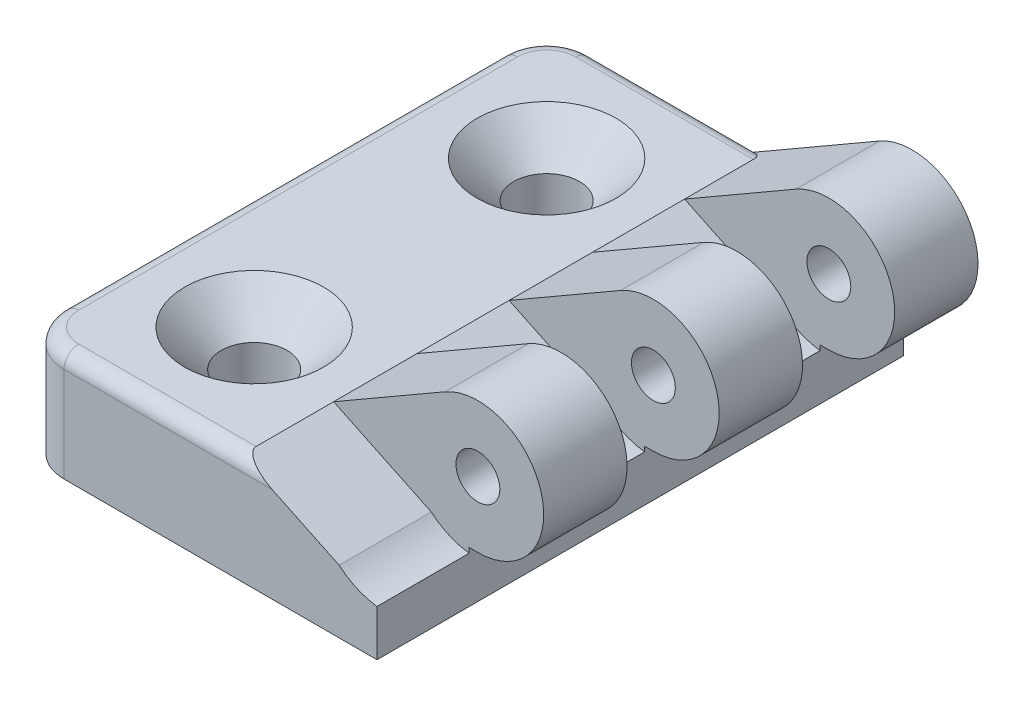
ISO-10303-21;
HEADER;
FILE_DESCRIPTION(('STEP AP214'),'2;1');
FILE_NAME('part.step','',(''),(''),'','','');
FILE_SCHEMA(('AUTOMOTIVE_DESIGN { 1 0 10303 214 1 1 1 1 }'));
ENDSEC;
DATA;
#1=APPLICATION_CONTEXT('core data for automotive mechanical design processes');
#2=APPLICATION_PROTOCOL_DEFINITION('international standard','automotive_design',2000,#1);
#3=PRODUCT_CONTEXT('',#1,'mechanical');
#4=PRODUCT('Part','Part','',(#3));
#5=PRODUCT_RELATED_PRODUCT_CATEGORY('part','',(#4));
#6=PRODUCT_DEFINITION_FORMATION('','',#4);
#7=PRODUCT_DEFINITION_CONTEXT('part definition',#1,'design');
#8=PRODUCT_DEFINITION('design','',#6,#7);
#9=PRODUCT_DEFINITION_SHAPE('','',#8);
#10=(LENGTH_UNIT() NAMED_UNIT(*) SI_UNIT(.MILLI.,.METRE.));
#11=(NAMED_UNIT(*) PLANE_ANGLE_UNIT() SI_UNIT($,.RADIAN.));
#12=(NAMED_UNIT(*) SI_UNIT($,.STERADIAN.) SOLID_ANGLE_UNIT());
#13=UNCERTAINTY_MEASURE_WITH_UNIT(LENGTH_MEASURE(1.E-05),#10,'distance_accuracy_value','');
#14=(GEOMETRIC_REPRESENTATION_CONTEXT(3) GLOBAL_UNCERTAINTY_ASSIGNED_CONTEXT((#13)) GLOBAL_UNIT_ASSIGNED_CONTEXT((#10,
#11,#12)) REPRESENTATION_CONTEXT('',''));
#15=CARTESIAN_POINT('',(0.,0.,0.));
#16=DIRECTION('',(0.,0.,1.));
#17=DIRECTION('',(1.,0.,0.));
#18=AXIS2_PLACEMENT_3D('',#15,#16,#17);
#19=CARTESIAN_POINT('',(12.75,7.89711431702908,-36.));
#20=DIRECTION('',(-0.499999999999995,0.866025403784442,0.));
#21=DIRECTION('',(-0.866025403784442,-0.499999999999995,0.));
#22=AXIS2_PLACEMENT_3D('',#19,#20,#21);
#23=PLANE('',#22);
#24=DIRECTION('',(-0.866025403784442,-0.499999999999995,0.));
#25=VECTOR('',#24,1.);
#26=CARTESIAN_POINT('',(12.75,7.89711431702908,-36.));
#27=LINE('',#26,#25);
#28=CARTESIAN_POINT('',(12.75,7.89711431702908,-36.));
#29=VERTEX_POINT('',#28);
#30=CARTESIAN_POINT('',(3.40192378864723,2.49999999999948,-36.));
#31=VERTEX_POINT('',#30);
#32=EDGE_CURVE('E286',#29,#31,#27,.T.);
#33=ORIENTED_EDGE('',*,*,#32,.T.);
#34=CARTESIAN_POINT('',(3.40192378864724,2.49999999999948,-35.));
#35=DIRECTION('',(-0.499999999999995,0.866025403784442,0.));
#36=DIRECTION('',(0.866025403784442,0.499999999999995,0.));
#37=AXIS2_PLACEMENT_3D('',#34,#35,#36);
#38=ELLIPSE('',#37,2.00000000000002,1.);
#39=CARTESIAN_POINT('',(5.13397459621614,3.49999999999948,-35.));
#40=VERTEX_POINT('',#39);
#41=EDGE_CURVE('E11',#31,#40,#38,.F.);
#42=ORIENTED_EDGE('',*,*,#41,.T.);
#43=DIRECTION('',(0.,0.,1.));
#44=VECTOR('',#43,1.);
#45=CARTESIAN_POINT('',(5.13397459621614,3.49999999999948,-36.));
#46=LINE('',#45,#44);
#47=CARTESIAN_POINT('',(5.13397459621614,3.49999999999948,-30.3));
#48=VERTEX_POINT('',#47);
#49=EDGE_CURVE('E236',#40,#48,#46,.T.);
#50=ORIENTED_EDGE('',*,*,#49,.T.);
#51=DIRECTION('',(-0.866025403784442,-0.499999999999995,0.));
#52=VECTOR('',#51,1.);
#53=CARTESIAN_POINT('',(12.75,7.89711431702908,-30.3));
#54=LINE('',#53,#52);
#55=CARTESIAN_POINT('',(12.75,7.89711431702908,-30.3));
#56=VERTEX_POINT('',#55);
#57=EDGE_CURVE('E223',#56,#48,#54,.T.);
#58=ORIENTED_EDGE('',*,*,#57,.F.);
#59=DIRECTION('',(0.,0.,1.));
#60=VECTOR('',#59,1.);
#61=CARTESIAN_POINT('',(12.75,7.89711431702908,-36.));
#62=LINE('',#61,#60);
#63=EDGE_CURVE('E233',#29,#56,#62,.T.);
#64=ORIENTED_EDGE('',*,*,#63,.F.);
#65=EDGE_LOOP('',(#33,#42,#50,#58,#64));
#66=FACE_BOUND('',#65,.T.);
#67=ADVANCED_FACE('F38',(#66),#23,.T.);
#68=CARTESIAN_POINT('',(15.,3.99999999999909,-36.));
#69=DIRECTION('',(0.,0.,1.));
#70=DIRECTION('',(1.,0.,0.));
#71=AXIS2_PLACEMENT_3D('',#68,#69,#70);
#72=CYLINDRICAL_SURFACE('',#71,4.5);
#73=ORIENTED_EDGE('',*,*,#63,.T.);
#74=CARTESIAN_POINT('',(15.,3.99999999999909,-30.3));
#75=DIRECTION('',(0.,0.,1.));
#76=DIRECTION('',(1.,0.,0.));
#77=AXIS2_PLACEMENT_3D('',#74,#75,#76);
#78=CIRCLE('',#77,4.5);
#79=CARTESIAN_POINT('',(14.9999999999995,-0.500000000000907,-30.3));
#80=VERTEX_POINT('',#79);
#81=EDGE_CURVE('E218',#80,#56,#78,.T.);
#82=ORIENTED_EDGE('',*,*,#81,.F.);
#83=DIRECTION('',(0.,0.,1.));
#84=VECTOR('',#83,1.);
#85=CARTESIAN_POINT('',(14.9999999999995,-0.500000000000907,-36.));
#86=LINE('',#85,#84);
#87=CARTESIAN_POINT('',(14.9999999999995,-0.500000000000907,-36.));
#88=VERTEX_POINT('',#87);
#89=EDGE_CURVE('E250',#88,#80,#86,.T.);
#90=ORIENTED_EDGE('',*,*,#89,.F.);
#91=CARTESIAN_POINT('',(15.,3.99999999999909,-36.));
#92=DIRECTION('',(0.,0.,1.));
#93=DIRECTION('',(1.,0.,0.));
#94=AXIS2_PLACEMENT_3D('',#91,#92,#93);
#95=CIRCLE('',#94,4.5);
#96=EDGE_CURVE('E242',#88,#29,#95,.T.);
#97=ORIENTED_EDGE('',*,*,#96,.T.);
#98=EDGE_LOOP('',(#73,#82,#90,#97));
#99=FACE_BOUND('',#98,.T.);
#100=ADVANCED_FACE('F240',(#99),#72,.T.);
#101=CARTESIAN_POINT('',(14.9999999999995,-0.500000000000907,-36.));
#102=DIRECTION('',(0.,-1.,0.));
#103=DIRECTION('',(1.,0.,0.));
#104=AXIS2_PLACEMENT_3D('',#101,#102,#103);
#105=PLANE('',#104);
#106=ORIENTED_EDGE('',*,*,#89,.T.);
#107=DIRECTION('',(-1.,0.,0.));
#108=VECTOR('',#107,1.);
#109=CARTESIAN_POINT('',(14.9999999999995,-0.500000000000907,-30.3));
#110=LINE('',#109,#108);
#111=CARTESIAN_POINT('',(14.3999999999995,-0.500000000000907,-30.3));
#112=VERTEX_POINT('',#111);
#113=EDGE_CURVE('E226',#80,#112,#110,.T.);
#114=ORIENTED_EDGE('',*,*,#113,.T.);
#115=DIRECTION('',(0.,0.,1.));
#116=VECTOR('',#115,1.);
#117=CARTESIAN_POINT('',(14.3999999999995,-0.500000000000907,-36.));
#118=LINE('',#117,#116);
#119=CARTESIAN_POINT('',(14.3999999999995,-0.500000000000907,-36.));
#120=VERTEX_POINT('',#119);
#121=EDGE_CURVE('E261',#120,#112,#118,.T.);
#122=ORIENTED_EDGE('',*,*,#121,.F.);
#123=DIRECTION('',(1.,0.,0.));
#124=VECTOR('',#123,1.);
#125=CARTESIAN_POINT('',(14.9999999999995,-0.500000000000907,-36.));
#126=LINE('',#125,#124);
#127=EDGE_CURVE('E478',#120,#88,#126,.T.);
#128=ORIENTED_EDGE('',*,*,#127,.T.);
#129=EDGE_LOOP('',(#106,#114,#122,#128));
#130=FACE_BOUND('',#129,.T.);
#131=ADVANCED_FACE('F523',(#130),#105,.T.);
#132=CARTESIAN_POINT('',(15.,3.99999999999909,-36.));
#133=DIRECTION('',(0.,0.,1.));
#134=DIRECTION('',(1.,0.,0.));
#135=AXIS2_PLACEMENT_3D('',#132,#133,#134);
#136=CYLINDRICAL_SURFACE('',#135,1.5);
#137=CARTESIAN_POINT('',(15.,3.99999999999909,-36.));
#138=DIRECTION('',(0.,0.,1.));
#139=DIRECTION('',(1.,0.,0.));
#140=AXIS2_PLACEMENT_3D('',#137,#138,#139);
#141=CIRCLE('',#140,1.5);
#142=CARTESIAN_POINT('',(16.5,3.99999999999909,-36.));
#143=VERTEX_POINT('',#142);
#144=EDGE_CURVE('E469',#143,#143,#141,.T.);
#145=ORIENTED_EDGE('',*,*,#144,.F.);
#146=EDGE_LOOP('',(#145));
#147=FACE_BOUND('',#146,.T.);
#148=CARTESIAN_POINT('',(15.,3.99999999999909,-30.3));
#149=DIRECTION('',(0.,0.,1.));
#150=DIRECTION('',(1.,0.,0.));
#151=AXIS2_PLACEMENT_3D('',#148,#149,#150);
#152=CIRCLE('',#151,1.5);
#153=CARTESIAN_POINT('',(16.5,3.99999999999909,-30.3));
#154=VERTEX_POINT('',#153);
#155=EDGE_CURVE('E400',#154,#154,#152,.F.);
#156=ORIENTED_EDGE('',*,*,#155,.F.);
#157=EDGE_LOOP('',(#156));
#158=FACE_BOUND('',#157,.T.);
#159=ADVANCED_FACE('F532',(#147,#158),#136,.F.);
#160=CARTESIAN_POINT('',(14.3999999999995,-0.500000000000907,-36.));
#161=DIRECTION('',(1.,0.,0.));
#162=DIRECTION('',(0.,1.,0.));
#163=AXIS2_PLACEMENT_3D('',#160,#161,#162);
#164=PLANE('',#163);
#165=ORIENTED_EDGE('',*,*,#121,.T.);
#166=DIRECTION('',(0.,-1.,0.));
#167=VECTOR('',#166,1.);
#168=CARTESIAN_POINT('',(14.3999999999995,-0.500000000000907,-30.3));
#169=LINE('',#168,#167);
#170=CARTESIAN_POINT('',(14.3999999999996,-0.842600763875235,-30.3));
#171=VERTEX_POINT('',#170);
#172=EDGE_CURVE('E301',#112,#171,#169,.T.);
#173=ORIENTED_EDGE('',*,*,#172,.T.);
#174=DIRECTION('',(0.,0.,1.));
#175=VECTOR('',#174,1.);
#176=CARTESIAN_POINT('',(14.3999999999996,-0.842600763875235,-30.3));
#177=LINE('',#176,#175);
#178=CARTESIAN_POINT('',(14.3999999999996,-0.842600763875235,-24.));
#179=VERTEX_POINT('',#178);
#180=EDGE_CURVE('E388',#171,#179,#177,.T.);
#181=ORIENTED_EDGE('',*,*,#180,.T.);
#182=DIRECTION('',(0.,-1.,0.));
#183=VECTOR('',#182,1.);
#184=CARTESIAN_POINT('',(14.3999999999995,-0.500000000000907,-24.));
#185=LINE('',#184,#183);
#186=CARTESIAN_POINT('',(14.3999999999995,-0.500000000000907,-24.));
#187=VERTEX_POINT('',#186);
#188=EDGE_CURVE('E299',#187,#179,#185,.T.);
#189=ORIENTED_EDGE('',*,*,#188,.F.);
#190=CARTESIAN_POINT('',(14.3999999999995,-0.500000000000907,-18.3));
#191=VERTEX_POINT('',#190);
#192=EDGE_CURVE('E268',#187,#191,#118,.T.);
#193=ORIENTED_EDGE('',*,*,#192,.T.);
#194=DIRECTION('',(0.,-1.,0.));
#195=VECTOR('',#194,1.);
#196=CARTESIAN_POINT('',(14.3999999999995,-0.500000000000907,-18.3));
#197=LINE('',#196,#195);
#198=CARTESIAN_POINT('',(14.3999999999996,-0.842600763875235,-18.3));
#199=VERTEX_POINT('',#198);
#200=EDGE_CURVE('E296',#191,#199,#197,.T.);
#201=ORIENTED_EDGE('',*,*,#200,.T.);
#202=DIRECTION('',(0.,0.,1.));
#203=VECTOR('',#202,1.);
#204=CARTESIAN_POINT('',(14.3999999999996,-0.842600763875235,-18.3));
#205=LINE('',#204,#203);
#206=CARTESIAN_POINT('',(14.3999999999996,-0.842600763875235,-12.));
#207=VERTEX_POINT('',#206);
#208=EDGE_CURVE('E427',#199,#207,#205,.T.);
#209=ORIENTED_EDGE('',*,*,#208,.T.);
#210=DIRECTION('',(0.,-1.,0.));
#211=VECTOR('',#210,1.);
#212=CARTESIAN_POINT('',(14.3999999999995,-0.500000000000907,-12.));
#213=LINE('',#212,#211);
#214=CARTESIAN_POINT('',(14.3999999999995,-0.500000000000907,-12.));
#215=VERTEX_POINT('',#214);
#216=EDGE_CURVE('E294',#215,#207,#213,.T.);
#217=ORIENTED_EDGE('',*,*,#216,.F.);
#218=CARTESIAN_POINT('',(14.3999999999995,-0.500000000000907,-6.3));
#219=VERTEX_POINT('',#218);
#220=EDGE_CURVE('E269',#215,#219,#118,.T.);
#221=ORIENTED_EDGE('',*,*,#220,.T.);
#222=DIRECTION('',(0.,-1.,0.));
#223=VECTOR('',#222,1.);
#224=CARTESIAN_POINT('',(14.3999999999995,-0.500000000000907,-6.3));
#225=LINE('',#224,#223);
#226=CARTESIAN_POINT('',(14.3999999999996,-0.842600763875235,-6.3));
#227=VERTEX_POINT('',#226);
#228=EDGE_CURVE('E292',#219,#227,#225,.T.);
#229=ORIENTED_EDGE('',*,*,#228,.T.);
#230=DIRECTION('',(0.,0.,1.));
#231=VECTOR('',#230,1.);
#232=CARTESIAN_POINT('',(14.3999999999996,-0.842600763875235,-6.3));
#233=LINE('',#232,#231);
#234=CARTESIAN_POINT('',(14.3999999999996,-0.842600763875235,0.));
#235=VERTEX_POINT('',#234);
#236=EDGE_CURVE('E293',#227,#235,#233,.T.);
#237=ORIENTED_EDGE('',*,*,#236,.T.);
#238=DIRECTION('',(0.,1.,0.));
#239=VECTOR('',#238,1.);
#240=CARTESIAN_POINT('',(14.3999999999995,-0.500000000000907,0.));
#241=LINE('',#240,#239);
#242=CARTESIAN_POINT('',(14.3999999999996,-4.00000000000052,0.));
#243=VERTEX_POINT('',#242);
#244=EDGE_CURVE('E476',#243,#235,#241,.T.);
#245=ORIENTED_EDGE('',*,*,#244,.F.);
#246=DIRECTION('',(0.,0.,1.));
#247=VECTOR('',#246,1.);
#248=CARTESIAN_POINT('',(14.3999999999996,-4.00000000000052,-36.));
#249=LINE('',#248,#247);
#250=CARTESIAN_POINT('',(14.3999999999996,-4.00000000000052,-36.));
#251=VERTEX_POINT('',#250);
#252=EDGE_CURVE('E274',#251,#243,#249,.T.);
#253=ORIENTED_EDGE('',*,*,#252,.F.);
#254=DIRECTION('',(0.,1.,0.));
#255=VECTOR('',#254,1.);
#256=CARTESIAN_POINT('',(14.3999999999995,-0.500000000000907,-36.));
#257=LINE('',#256,#255);
#258=EDGE_CURVE('E475',#251,#120,#257,.T.);
#259=ORIENTED_EDGE('',*,*,#258,.T.);
#260=EDGE_LOOP('',(#165,#173,#181,#189,#193,#201,#209,#217,#221,#229,#237,#245,#253,#259));
#261=FACE_BOUND('',#260,.T.);
#262=ADVANCED_FACE('F547',(#261),#164,.T.);
#263=DIRECTION('',(-0.866025403784442,-0.499999999999995,0.));
#264=VECTOR('',#263,1.);
#265=CARTESIAN_POINT('',(12.75,7.89711431702908,-24.));
#266=LINE('',#265,#264);
#267=CARTESIAN_POINT('',(12.75,7.89711431702908,-24.));
#268=VERTEX_POINT('',#267);
#269=CARTESIAN_POINT('',(5.13397459621614,3.49999999999948,-24.));
#270=VERTEX_POINT('',#269);
#271=EDGE_CURVE('E380',#268,#270,#266,.T.);
#272=ORIENTED_EDGE('',*,*,#271,.T.);
#273=CARTESIAN_POINT('',(5.13397459621614,3.49999999999948,-18.3));
#274=VERTEX_POINT('',#273);
#275=EDGE_CURVE('E247',#270,#274,#46,.T.);
#276=ORIENTED_EDGE('',*,*,#275,.T.);
#277=DIRECTION('',(-0.866025403784442,-0.499999999999995,0.));
#278=VECTOR('',#277,1.);
#279=CARTESIAN_POINT('',(12.75,7.89711431702908,-18.3));
#280=LINE('',#279,#278);
#281=CARTESIAN_POINT('',(12.75,7.89711431702908,-18.3));
#282=VERTEX_POINT('',#281);
#283=EDGE_CURVE('E407',#282,#274,#280,.T.);
#284=ORIENTED_EDGE('',*,*,#283,.F.);
#285=EDGE_CURVE('E244',#268,#282,#62,.T.);
#286=ORIENTED_EDGE('',*,*,#285,.F.);
#287=EDGE_LOOP('',(#272,#276,#284,#286));
#288=FACE_BOUND('',#287,.T.);
#289=ADVANCED_FACE('F488',(#288),#23,.T.);
#290=CARTESIAN_POINT('',(15.,3.99999999999909,-24.));
#291=DIRECTION('',(0.,0.,1.));
#292=DIRECTION('',(1.,0.,0.));
#293=AXIS2_PLACEMENT_3D('',#290,#291,#292);
#294=CIRCLE('',#293,4.5);
#295=CARTESIAN_POINT('',(14.9999999999995,-0.500000000000907,-24.));
#296=VERTEX_POINT('',#295);
#297=EDGE_CURVE('E370',#296,#268,#294,.T.);
#298=ORIENTED_EDGE('',*,*,#297,.T.);
#299=ORIENTED_EDGE('',*,*,#285,.T.);
#300=CARTESIAN_POINT('',(15.,3.99999999999909,-18.3));
#301=DIRECTION('',(0.,0.,1.));
#302=DIRECTION('',(1.,0.,0.));
#303=AXIS2_PLACEMENT_3D('',#300,#301,#302);
#304=CIRCLE('',#303,4.5);
#305=CARTESIAN_POINT('',(14.9999999999995,-0.500000000000907,-18.3));
#306=VERTEX_POINT('',#305);
#307=EDGE_CURVE('E404',#306,#282,#304,.T.);
#308=ORIENTED_EDGE('',*,*,#307,.F.);
#309=EDGE_CURVE('E256',#296,#306,#86,.T.);
#310=ORIENTED_EDGE('',*,*,#309,.F.);
#311=EDGE_LOOP('',(#298,#299,#308,#310));
#312=FACE_BOUND('',#311,.T.);
#313=ADVANCED_FACE('F535',(#312),#72,.T.);
#314=DIRECTION('',(-1.,0.,0.));
#315=VECTOR('',#314,1.);
#316=CARTESIAN_POINT('',(14.9999999999995,-0.500000000000907,-24.));
#317=LINE('',#316,#315);
#318=EDGE_CURVE('E391',#296,#187,#317,.T.);
#319=ORIENTED_EDGE('',*,*,#318,.F.);
#320=ORIENTED_EDGE('',*,*,#309,.T.);
#321=DIRECTION('',(-1.,0.,0.));
#322=VECTOR('',#321,1.);
#323=CARTESIAN_POINT('',(14.9999999999995,-0.500000000000907,-18.3));
#324=LINE('',#323,#322);
#325=EDGE_CURVE('E438',#306,#191,#324,.T.);
#326=ORIENTED_EDGE('',*,*,#325,.T.);
#327=ORIENTED_EDGE('',*,*,#192,.F.);
#328=EDGE_LOOP('',(#319,#320,#326,#327));
#329=FACE_BOUND('',#328,.T.);
#330=ADVANCED_FACE('F524',(#329),#105,.T.);
#331=CARTESIAN_POINT('',(15.,3.99999999999909,-24.));
#332=DIRECTION('',(0.,0.,1.));
#333=DIRECTION('',(1.,0.,0.));
#334=AXIS2_PLACEMENT_3D('',#331,#332,#333);
#335=CIRCLE('',#334,1.5);
#336=CARTESIAN_POINT('',(16.5,3.99999999999909,-24.));
#337=VERTEX_POINT('',#336);
#338=EDGE_CURVE('E396',#337,#337,#335,.F.);
#339=ORIENTED_EDGE('',*,*,#338,.T.);
#340=EDGE_LOOP('',(#339));
#341=FACE_BOUND('',#340,.T.);
#342=CARTESIAN_POINT('',(15.,3.99999999999909,-18.3));
#343=DIRECTION('',(0.,0.,1.));
#344=DIRECTION('',(1.,0.,0.));
#345=AXIS2_PLACEMENT_3D('',#342,#343,#344);
#346=CIRCLE('',#345,1.5);
#347=CARTESIAN_POINT('',(16.5,3.99999999999909,-18.3));
#348=VERTEX_POINT('',#347);
#349=EDGE_CURVE('E441',#348,#348,#346,.F.);
#350=ORIENTED_EDGE('',*,*,#349,.F.);
#351=EDGE_LOOP('',(#350));
#352=FACE_BOUND('',#351,.T.);
#353=ADVANCED_FACE('F533',(#341,#352),#136,.F.);
#354=DIRECTION('',(-0.866025403784442,-0.499999999999995,0.));
#355=VECTOR('',#354,1.);
#356=CARTESIAN_POINT('',(12.75,7.89711431702908,-12.));
#357=LINE('',#356,#355);
#358=CARTESIAN_POINT('',(12.75,7.89711431702908,-12.));
#359=VERTEX_POINT('',#358);
#360=CARTESIAN_POINT('',(5.13397459621614,3.49999999999948,-12.));
#361=VERTEX_POINT('',#360);
#362=EDGE_CURVE('E419',#359,#361,#357,.T.);
#363=ORIENTED_EDGE('',*,*,#362,.T.);
#364=CARTESIAN_POINT('',(5.13397459621614,3.49999999999948,-6.3));
#365=VERTEX_POINT('',#364);
#366=EDGE_CURVE('E243',#361,#365,#46,.T.);
#367=ORIENTED_EDGE('',*,*,#366,.T.);
#368=DIRECTION('',(-0.866025403784442,-0.499999999999995,0.));
#369=VECTOR('',#368,1.);
#370=CARTESIAN_POINT('',(12.75,7.89711431702908,-6.3));
#371=LINE('',#370,#369);
#372=CARTESIAN_POINT('',(12.75,7.89711431702908,-6.3));
#373=VERTEX_POINT('',#372);
#374=EDGE_CURVE('E447',#373,#365,#371,.T.);
#375=ORIENTED_EDGE('',*,*,#374,.F.);
#376=EDGE_CURVE('E246',#359,#373,#62,.T.);
#377=ORIENTED_EDGE('',*,*,#376,.F.);
#378=EDGE_LOOP('',(#363,#367,#375,#377));
#379=FACE_BOUND('',#378,.T.);
#380=ADVANCED_FACE('F509',(#379),#23,.T.);
#381=CARTESIAN_POINT('',(15.,3.99999999999909,-12.));
#382=DIRECTION('',(0.,0.,1.));
#383=DIRECTION('',(1.,0.,0.));
#384=AXIS2_PLACEMENT_3D('',#381,#382,#383);
#385=CIRCLE('',#384,4.5);
#386=CARTESIAN_POINT('',(14.9999999999995,-0.500000000000907,-12.));
#387=VERTEX_POINT('',#386);
#388=EDGE_CURVE('E403',#387,#359,#385,.T.);
#389=ORIENTED_EDGE('',*,*,#388,.T.);
#390=ORIENTED_EDGE('',*,*,#376,.T.);
#391=CARTESIAN_POINT('',(15.,3.99999999999909,-6.3));
#392=DIRECTION('',(0.,0.,1.));
#393=DIRECTION('',(1.,0.,0.));
#394=AXIS2_PLACEMENT_3D('',#391,#392,#393);
#395=CIRCLE('',#394,4.5);
#396=CARTESIAN_POINT('',(14.9999999999995,-0.500000000000907,-6.3));
#397=VERTEX_POINT('',#396);
#398=EDGE_CURVE('E445',#397,#373,#395,.T.);
#399=ORIENTED_EDGE('',*,*,#398,.F.);
#400=EDGE_CURVE('E257',#387,#397,#86,.T.);
#401=ORIENTED_EDGE('',*,*,#400,.F.);
#402=EDGE_LOOP('',(#389,#390,#399,#401));
#403=FACE_BOUND('',#402,.T.);
#404=ADVANCED_FACE('F515',(#403),#72,.T.);
#405=DIRECTION('',(-1.,0.,0.));
#406=VECTOR('',#405,1.);
#407=CARTESIAN_POINT('',(14.9999999999995,-0.500000000000907,-12.));
#408=LINE('',#407,#406);
#409=EDGE_CURVE('E430',#387,#215,#408,.T.);
#410=ORIENTED_EDGE('',*,*,#409,.F.);
#411=ORIENTED_EDGE('',*,*,#400,.T.);
#412=DIRECTION('',(-1.,0.,0.));
#413=VECTOR('',#412,1.);
#414=CARTESIAN_POINT('',(14.9999999999995,-0.500000000000907,-6.3));
#415=LINE('',#414,#413);
#416=EDGE_CURVE('E467',#397,#219,#415,.T.);
#417=ORIENTED_EDGE('',*,*,#416,.T.);
#418=ORIENTED_EDGE('',*,*,#220,.F.);
#419=EDGE_LOOP('',(#410,#411,#417,#418));
#420=FACE_BOUND('',#419,.T.);
#421=ADVANCED_FACE('F519',(#420),#105,.T.);
#422=CARTESIAN_POINT('',(15.,3.99999999999909,-12.));
#423=DIRECTION('',(0.,0.,1.));
#424=DIRECTION('',(1.,0.,0.));
#425=AXIS2_PLACEMENT_3D('',#422,#423,#424);
#426=CIRCLE('',#425,1.5);
#427=CARTESIAN_POINT('',(16.5,3.99999999999909,-12.));
#428=VERTEX_POINT('',#427);
#429=EDGE_CURVE('E435',#428,#428,#426,.F.);
#430=ORIENTED_EDGE('',*,*,#429,.T.);
#431=EDGE_LOOP('',(#430));
#432=FACE_BOUND('',#431,.T.);
#433=CARTESIAN_POINT('',(15.,3.99999999999909,-6.3));
#434=DIRECTION('',(0.,0.,1.));
#435=DIRECTION('',(1.,0.,0.));
#436=AXIS2_PLACEMENT_3D('',#433,#434,#435);
#437=CIRCLE('',#436,1.5);
#438=CARTESIAN_POINT('',(16.5,3.99999999999909,-6.3));
#439=VERTEX_POINT('',#438);
#440=EDGE_CURVE('E289',#439,#439,#437,.F.);
#441=ORIENTED_EDGE('',*,*,#440,.F.);
#442=EDGE_LOOP('',(#441));
#443=FACE_BOUND('',#442,.T.);
#444=ADVANCED_FACE('F521',(#432,#443),#136,.F.);
#445=CARTESIAN_POINT('',(-9.99999999999999,-4.00000000000065,-36.));
#446=DIRECTION('',(-1.,0.,0.));
#447=DIRECTION('',(0.,0.,1.));
#448=AXIS2_PLACEMENT_3D('',#445,#446,#447);
#449=PLANE('',#448);
#450=DIRECTION('',(0.,-1.,0.));
#451=VECTOR('',#450,1.);
#452=CARTESIAN_POINT('',(-9.99999999999999,-4.00000000000065,-3.));
#453=LINE('',#452,#451);
#454=CARTESIAN_POINT('',(-9.99999999999999,-4.00000000000065,-3.));
#455=VERTEX_POINT('',#454);
#456=CARTESIAN_POINT('',(-9.99999999999999,2.49999999999948,-3.));
#457=VERTEX_POINT('',#456);
#458=EDGE_CURVE('E315',#455,#457,#453,.F.);
#459=ORIENTED_EDGE('',*,*,#458,.T.);
#460=DIRECTION('',(0.,0.,1.));
#461=VECTOR('',#460,1.);
#462=CARTESIAN_POINT('',(-9.99999999999999,2.49999999999948,-36.));
#463=LINE('',#462,#461);
#464=CARTESIAN_POINT('',(-9.99999999999999,2.49999999999948,-33.));
#465=VERTEX_POINT('',#464);
#466=EDGE_CURVE('E47',#457,#465,#463,.F.);
#467=ORIENTED_EDGE('',*,*,#466,.T.);
#468=DIRECTION('',(0.,-1.,0.));
#469=VECTOR('',#468,1.);
#470=CARTESIAN_POINT('',(-9.99999999999999,-4.00000000000065,-33.));
#471=LINE('',#470,#469);
#472=CARTESIAN_POINT('',(-9.99999999999999,-4.00000000000065,-33.));
#473=VERTEX_POINT('',#472);
#474=EDGE_CURVE('E317',#465,#473,#471,.T.);
#475=ORIENTED_EDGE('',*,*,#474,.T.);
#476=DIRECTION('',(0.,0.,1.));
#477=VECTOR('',#476,1.);
#478=CARTESIAN_POINT('',(-9.99999999999999,-4.00000000000065,-36.));
#479=LINE('',#478,#477);
#480=EDGE_CURVE('E280',#473,#455,#479,.T.);
#481=ORIENTED_EDGE('',*,*,#480,.T.);
#482=EDGE_LOOP('',(#459,#467,#475,#481));
#483=FACE_BOUND('',#482,.T.);
#484=ADVANCED_FACE('F529',(#483),#449,.T.);
#485=CARTESIAN_POINT('',(-9.99999999999999,3.49999999999948,-36.));
#486=DIRECTION('',(0.,1.,0.));
#487=DIRECTION('',(-1.,0.,0.));
#488=AXIS2_PLACEMENT_3D('',#485,#486,#487);
#489=PLANE('',#488);
#490=ORIENTED_EDGE('',*,*,#49,.F.);
#491=DIRECTION('',(-1.,0.,0.));
#492=VECTOR('',#491,1.);
#493=CARTESIAN_POINT('',(-6.99999999999999,3.49999999999948,-35.));
#494=LINE('',#493,#492);
#495=CARTESIAN_POINT('',(-6.99999999999999,3.49999999999948,-35.));
#496=VERTEX_POINT('',#495);
#497=EDGE_CURVE('E336',#40,#496,#494,.T.);
#498=ORIENTED_EDGE('',*,*,#497,.T.);
#499=CARTESIAN_POINT('',(-6.99999999999999,3.49999999999948,-33.));
#500=DIRECTION('',(0.,1.,0.));
#501=DIRECTION('',(-1.,0.,0.));
#502=AXIS2_PLACEMENT_3D('',#499,#500,#501);
#503=CIRCLE('',#502,2.);
#504=CARTESIAN_POINT('',(-8.99999999999999,3.49999999999948,-33.));
#505=VERTEX_POINT('',#504);
#506=EDGE_CURVE('E334',#496,#505,#503,.T.);
#507=ORIENTED_EDGE('',*,*,#506,.T.);
#508=DIRECTION('',(0.,0.,1.));
#509=VECTOR('',#508,1.);
#510=CARTESIAN_POINT('',(-8.99999999999999,3.49999999999948,-36.));
#511=LINE('',#510,#509);
#512=CARTESIAN_POINT('',(-8.99999999999999,3.49999999999948,-3.));
#513=VERTEX_POINT('',#512);
#514=EDGE_CURVE('E328',#505,#513,#511,.T.);
#515=ORIENTED_EDGE('',*,*,#514,.T.);
#516=CARTESIAN_POINT('',(-6.99999999999999,3.49999999999948,-3.));
#517=DIRECTION('',(0.,1.,0.));
#518=DIRECTION('',(-1.,0.,0.));
#519=AXIS2_PLACEMENT_3D('',#516,#517,#518);
#520=CIRCLE('',#519,2.);
#521=CARTESIAN_POINT('',(-6.99999999999999,3.49999999999948,-1.));
#522=VERTEX_POINT('',#521);
#523=EDGE_CURVE('E330',#513,#522,#520,.T.);
#524=ORIENTED_EDGE('',*,*,#523,.T.);
#525=DIRECTION('',(-1.,0.,0.));
#526=VECTOR('',#525,1.);
#527=CARTESIAN_POINT('',(-9.99999999999999,3.49999999999948,-1.));
#528=LINE('',#527,#526);
#529=CARTESIAN_POINT('',(5.13397459621614,3.49999999999948,-1.));
#530=VERTEX_POINT('',#529);
#531=EDGE_CURVE('E332',#522,#530,#528,.F.);
#532=ORIENTED_EDGE('',*,*,#531,.T.);
#533=DIRECTION('',(0.,0.,1.));
#534=VECTOR('',#533,1.);
#535=CARTESIAN_POINT('',(5.13397459621614,3.49999999999948,-6.3));
#536=LINE('',#535,#534);
#537=EDGE_CURVE('E457',#365,#530,#536,.T.);
#538=ORIENTED_EDGE('',*,*,#537,.F.);
#539=ORIENTED_EDGE('',*,*,#366,.F.);
#540=DIRECTION('',(0.,0.,1.));
#541=VECTOR('',#540,1.);
#542=CARTESIAN_POINT('',(5.13397459621614,3.49999999999948,-18.3));
#543=LINE('',#542,#541);
#544=EDGE_CURVE('E417',#274,#361,#543,.T.);
#545=ORIENTED_EDGE('',*,*,#544,.F.);
#546=ORIENTED_EDGE('',*,*,#275,.F.);
#547=DIRECTION('',(0.,0.,1.));
#548=VECTOR('',#547,1.);
#549=CARTESIAN_POINT('',(5.13397459621614,3.49999999999948,-30.3));
#550=LINE('',#549,#548);
#551=EDGE_CURVE('E377',#48,#270,#550,.T.);
#552=ORIENTED_EDGE('',*,*,#551,.F.);
#553=EDGE_LOOP('',(#490,#498,#507,#515,#524,#532,#538,#539,#545,#546,#552));
#554=FACE_BOUND('',#553,.T.);
#555=CARTESIAN_POINT('',(-1.99999999999999,3.49999999999948,-8.));
#556=DIRECTION('',(0.,1.,0.));
#557=DIRECTION('',(-1.,0.,0.));
#558=AXIS2_PLACEMENT_3D('',#555,#556,#557);
#559=CIRCLE('',#558,4.75000000000002);
#560=CARTESIAN_POINT('',(-6.75000000000001,3.49999999999948,-8.));
#561=VERTEX_POINT('',#560);
#562=EDGE_CURVE('E309',#561,#561,#559,.F.);
#563=ORIENTED_EDGE('',*,*,#562,.T.);
#564=EDGE_LOOP('',(#563));
#565=FACE_BOUND('',#564,.T.);
#566=CARTESIAN_POINT('',(-1.99999999999999,3.49999999999948,-28.));
#567=DIRECTION('',(0.,1.,0.));
#568=DIRECTION('',(-1.,0.,0.));
#569=AXIS2_PLACEMENT_3D('',#566,#567,#568);
#570=CIRCLE('',#569,4.75000000000002);
#571=CARTESIAN_POINT('',(-6.75000000000001,3.49999999999948,-28.));
#572=VERTEX_POINT('',#571);
#573=EDGE_CURVE('E306',#572,#572,#570,.F.);
#574=ORIENTED_EDGE('',*,*,#573,.T.);
#575=EDGE_LOOP('',(#574));
#576=FACE_BOUND('',#575,.T.);
#577=ADVANCED_FACE('F503',(#554,#565,#576),#489,.T.);
#578=CARTESIAN_POINT('',(-9.99999999999999,-4.00000000000065,-36.));
#579=DIRECTION('',(0.,-1.,0.));
#580=DIRECTION('',(1.,0.,0.));
#581=AXIS2_PLACEMENT_3D('',#578,#579,#580);
#582=PLANE('',#581);
#583=CARTESIAN_POINT('',(-1.99999999999999,-4.00000000000065,-8.));
#584=DIRECTION('',(0.,1.,0.));
#585=DIRECTION('',(0.,0.,1.));
#586=AXIS2_PLACEMENT_3D('',#583,#584,#585);
#587=CIRCLE('',#586,2.25);
#588=CARTESIAN_POINT('',(-1.99999999999999,-4.00000000000065,-5.75));
#589=VERTEX_POINT('',#588);
#590=EDGE_CURVE('E360',#589,#589,#587,.T.);
#591=ORIENTED_EDGE('',*,*,#590,.T.);
#592=EDGE_LOOP('',(#591));
#593=FACE_BOUND('',#592,.T.);
#594=CARTESIAN_POINT('',(-1.99999999999999,-4.00000000000065,-28.));
#595=DIRECTION('',(0.,1.,0.));
#596=DIRECTION('',(0.,0.,1.));
#597=AXIS2_PLACEMENT_3D('',#594,#595,#596);
#598=CIRCLE('',#597,2.25);
#599=CARTESIAN_POINT('',(-1.99999999999999,-4.00000000000065,-25.75));
#600=VERTEX_POINT('',#599);
#601=EDGE_CURVE('E365',#600,#600,#598,.T.);
#602=ORIENTED_EDGE('',*,*,#601,.T.);
#603=EDGE_LOOP('',(#602));
#604=FACE_BOUND('',#603,.T.);
#605=ORIENTED_EDGE('',*,*,#480,.F.);
#606=CARTESIAN_POINT('',(-6.99999999999999,-4.00000000000063,-33.));
#607=DIRECTION('',(0.,-1.,0.));
#608=DIRECTION('',(1.,0.,0.));
#609=AXIS2_PLACEMENT_3D('',#606,#607,#608);
#610=CIRCLE('',#609,3.);
#611=CARTESIAN_POINT('',(-6.99999999999999,-4.00000000000063,-36.));
#612=VERTEX_POINT('',#611);
#613=EDGE_CURVE('E321',#473,#612,#610,.T.);
#614=ORIENTED_EDGE('',*,*,#613,.T.);
#615=DIRECTION('',(1.,0.,0.));
#616=VECTOR('',#615,1.);
#617=CARTESIAN_POINT('',(-9.99999999999999,-4.00000000000065,-36.));
#618=LINE('',#617,#616);
#619=EDGE_CURVE('E473',#612,#251,#618,.T.);
#620=ORIENTED_EDGE('',*,*,#619,.T.);
#621=ORIENTED_EDGE('',*,*,#252,.T.);
#622=DIRECTION('',(1.,0.,0.));
#623=VECTOR('',#622,1.);
#624=CARTESIAN_POINT('',(-9.99999999999999,-4.00000000000065,0.));
#625=LINE('',#624,#623);
#626=CARTESIAN_POINT('',(-6.99999999999999,-4.00000000000063,0.));
#627=VERTEX_POINT('',#626);
#628=EDGE_CURVE('E472',#627,#243,#625,.T.);
#629=ORIENTED_EDGE('',*,*,#628,.F.);
#630=CARTESIAN_POINT('',(-6.99999999999999,-4.00000000000063,-3.));
#631=DIRECTION('',(0.,-1.,0.));
#632=DIRECTION('',(1.,0.,0.));
#633=AXIS2_PLACEMENT_3D('',#630,#631,#632);
#634=CIRCLE('',#633,3.);
#635=EDGE_CURVE('E319',#627,#455,#634,.T.);
#636=ORIENTED_EDGE('',*,*,#635,.T.);
#637=EDGE_LOOP('',(#605,#614,#620,#621,#629,#636));
#638=FACE_BOUND('',#637,.T.);
#639=ADVANCED_FACE('F693',(#593,#604,#638),#582,.T.);
#640=CARTESIAN_POINT('',(15.,3.99999999999909,-36.));
#641=DIRECTION('',(0.,0.,1.));
#642=DIRECTION('',(1.,0.,0.));
#643=AXIS2_PLACEMENT_3D('',#640,#641,#642);
#644=PLANE('',#643);
#645=ORIENTED_EDGE('',*,*,#144,.T.);
#646=EDGE_LOOP('',(#645));
#647=FACE_BOUND('',#646,.T.);
#648=DIRECTION('',(0.,-1.,0.));
#649=VECTOR('',#648,1.);
#650=CARTESIAN_POINT('',(-6.99999999999999,3.49999999999948,-36.));
#651=LINE('',#650,#649);
#652=CARTESIAN_POINT('',(-6.99999999999999,2.49999999999948,-36.));
#653=VERTEX_POINT('',#652);
#654=EDGE_CURVE('E323',#612,#653,#651,.F.);
#655=ORIENTED_EDGE('',*,*,#654,.T.);
#656=DIRECTION('',(-1.,0.,0.));
#657=VECTOR('',#656,1.);
#658=CARTESIAN_POINT('',(5.13397459621614,2.49999999999948,-36.));
#659=LINE('',#658,#657);
#660=EDGE_CURVE('E339',#653,#31,#659,.F.);
#661=ORIENTED_EDGE('',*,*,#660,.T.);
#662=ORIENTED_EDGE('',*,*,#32,.F.);
#663=ORIENTED_EDGE('',*,*,#96,.F.);
#664=ORIENTED_EDGE('',*,*,#127,.F.);
#665=ORIENTED_EDGE('',*,*,#258,.F.);
#666=ORIENTED_EDGE('',*,*,#619,.F.);
#667=EDGE_LOOP('',(#655,#661,#662,#663,#664,#665,#666));
#668=FACE_BOUND('',#667,.T.);
#669=ADVANCED_FACE('F697',(#647,#668),#644,.F.);
#670=CARTESIAN_POINT('',(15.,3.99999999999909,0.));
#671=DIRECTION('',(0.,0.,1.));
#672=DIRECTION('',(1.,0.,0.));
#673=AXIS2_PLACEMENT_3D('',#670,#671,#672);
#674=PLANE('',#673);
#675=DIRECTION('',(0.90220196879568,-0.431313815569591,0.));
#676=VECTOR('',#675,1.);
#677=CARTESIAN_POINT('',(5.13397459621614,3.49999999999948,0.));
#678=LINE('',#677,#676);
#679=CARTESIAN_POINT('',(7.2257275988512,2.49999999999948,0.));
#680=VERTEX_POINT('',#679);
#681=CARTESIAN_POINT('',(11.8076100498392,0.309549002574857,0.));
#682=VERTEX_POINT('',#681);
#683=EDGE_CURVE('E444',#680,#682,#678,.T.);
#684=ORIENTED_EDGE('',*,*,#683,.F.);
#685=DIRECTION('',(-1.,0.,0.));
#686=VECTOR('',#685,1.);
#687=CARTESIAN_POINT('',(15.,2.49999999999948,0.));
#688=LINE('',#687,#686);
#689=CARTESIAN_POINT('',(-6.99999999999999,2.49999999999948,0.));
#690=VERTEX_POINT('',#689);
#691=EDGE_CURVE('E344',#680,#690,#688,.T.);
#692=ORIENTED_EDGE('',*,*,#691,.T.);
#693=DIRECTION('',(0.,-1.,0.));
#694=VECTOR('',#693,1.);
#695=CARTESIAN_POINT('',(-6.99999999999999,3.99999999999909,0.));
#696=LINE('',#695,#694);
#697=EDGE_CURVE('E326',#690,#627,#696,.T.);
#698=ORIENTED_EDGE('',*,*,#697,.T.);
#699=ORIENTED_EDGE('',*,*,#628,.T.);
#700=ORIENTED_EDGE('',*,*,#244,.T.);
#701=CARTESIAN_POINT('',(15.,3.99999999999909,0.));
#702=DIRECTION('',(0.,0.,1.));
#703=DIRECTION('',(-1.,0.,0.));
#704=AXIS2_PLACEMENT_3D('',#701,#702,#703);
#705=CIRCLE('',#704,4.87962930541625);
#706=EDGE_CURVE('E448',#682,#235,#705,.T.);
#707=ORIENTED_EDGE('',*,*,#706,.F.);
#708=EDGE_LOOP('',(#684,#692,#698,#699,#700,#707));
#709=FACE_BOUND('',#708,.T.);
#710=ADVANCED_FACE('F599',(#709),#674,.T.);
#711=CARTESIAN_POINT('',(15.,3.99999999999909,-6.3));
#712=DIRECTION('',(0.,0.,1.));
#713=DIRECTION('',(1.,0.,0.));
#714=AXIS2_PLACEMENT_3D('',#711,#712,#713);
#715=PLANE('',#714);
#716=ORIENTED_EDGE('',*,*,#398,.T.);
#717=ORIENTED_EDGE('',*,*,#374,.T.);
#718=DIRECTION('',(0.90220196879568,-0.431313815569591,0.));
#719=VECTOR('',#718,1.);
#720=CARTESIAN_POINT('',(5.13397459621614,3.49999999999948,-6.3));
#721=LINE('',#720,#719);
#722=CARTESIAN_POINT('',(11.8076100498392,0.309549002574857,-6.3));
#723=VERTEX_POINT('',#722);
#724=EDGE_CURVE('E451',#365,#723,#721,.T.);
#725=ORIENTED_EDGE('',*,*,#724,.T.);
#726=CARTESIAN_POINT('',(15.,3.99999999999909,-6.3));
#727=DIRECTION('',(0.,0.,1.));
#728=DIRECTION('',(-1.,0.,0.));
#729=AXIS2_PLACEMENT_3D('',#726,#727,#728);
#730=CIRCLE('',#729,4.87962930541625);
#731=EDGE_CURVE('E454',#723,#227,#730,.T.);
#732=ORIENTED_EDGE('',*,*,#731,.T.);
#733=ORIENTED_EDGE('',*,*,#228,.F.);
#734=ORIENTED_EDGE('',*,*,#416,.F.);
#735=EDGE_LOOP('',(#716,#717,#725,#732,#733,#734));
#736=FACE_BOUND('',#735,.T.);
#737=ORIENTED_EDGE('',*,*,#440,.T.);
#738=EDGE_LOOP('',(#737));
#739=FACE_BOUND('',#738,.T.);
#740=ADVANCED_FACE('F513',(#736,#739),#715,.T.);
#741=CARTESIAN_POINT('',(15.,3.99999999999909,-6.3));
#742=DIRECTION('',(0.,0.,1.));
#743=DIRECTION('',(1.,0.,0.));
#744=AXIS2_PLACEMENT_3D('',#741,#742,#743);
#745=CYLINDRICAL_SURFACE('',#744,4.87962930541625);
#746=ORIENTED_EDGE('',*,*,#706,.T.);
#747=ORIENTED_EDGE('',*,*,#236,.F.);
#748=ORIENTED_EDGE('',*,*,#731,.F.);
#749=DIRECTION('',(0.,0.,1.));
#750=VECTOR('',#749,1.);
#751=CARTESIAN_POINT('',(11.8076100498392,0.309549002574857,-6.3));
#752=LINE('',#751,#750);
#753=EDGE_CURVE('E462',#723,#682,#752,.T.);
#754=ORIENTED_EDGE('',*,*,#753,.T.);
#755=EDGE_LOOP('',(#746,#747,#748,#754));
#756=FACE_BOUND('',#755,.T.);
#757=ADVANCED_FACE('F598',(#756),#745,.F.);
#758=CARTESIAN_POINT('',(5.13397459621614,3.49999999999948,-6.3));
#759=DIRECTION('',(-0.431313815569591,-0.90220196879568,0.));
#760=DIRECTION('',(0.90220196879568,-0.431313815569591,0.));
#761=AXIS2_PLACEMENT_3D('',#758,#759,#760);
#762=PLANE('',#761);
#763=ORIENTED_EDGE('',*,*,#537,.T.);
#764=CARTESIAN_POINT('',(7.2257275988512,2.49999999999948,-1.));
#765=DIRECTION('',(-0.431313815569591,-0.90220196879568,0.));
#766=DIRECTION('',(-0.90220196879568,0.431313815569591,0.));
#767=AXIS2_PLACEMENT_3D('',#764,#765,#766);
#768=ELLIPSE('',#767,2.31849749278122,1.);
#769=EDGE_CURVE('E63',#530,#680,#768,.F.);
#770=ORIENTED_EDGE('',*,*,#769,.T.);
#771=ORIENTED_EDGE('',*,*,#683,.T.);
#772=ORIENTED_EDGE('',*,*,#753,.F.);
#773=ORIENTED_EDGE('',*,*,#724,.F.);
#774=EDGE_LOOP('',(#763,#770,#771,#772,#773));
#775=FACE_BOUND('',#774,.T.);
#776=ADVANCED_FACE('F510',(#775),#762,.F.);
#777=CARTESIAN_POINT('',(15.,3.99999999999909,-18.3));
#778=DIRECTION('',(0.,0.,1.));
#779=DIRECTION('',(1.,0.,0.));
#780=AXIS2_PLACEMENT_3D('',#777,#778,#779);
#781=PLANE('',#780);
#782=ORIENTED_EDGE('',*,*,#307,.T.);
#783=ORIENTED_EDGE('',*,*,#283,.T.);
#784=DIRECTION('',(0.90220196879568,-0.431313815569591,0.));
#785=VECTOR('',#784,1.);
#786=CARTESIAN_POINT('',(5.13397459621614,3.49999999999948,-18.3));
#787=LINE('',#786,#785);
#788=CARTESIAN_POINT('',(11.8076100498392,0.309549002574857,-18.3));
#789=VERTEX_POINT('',#788);
#790=EDGE_CURVE('E411',#274,#789,#787,.T.);
#791=ORIENTED_EDGE('',*,*,#790,.T.);
#792=CARTESIAN_POINT('',(15.,3.99999999999909,-18.3));
#793=DIRECTION('',(0.,0.,1.));
#794=DIRECTION('',(-1.,0.,0.));
#795=AXIS2_PLACEMENT_3D('',#792,#793,#794);
#796=CIRCLE('',#795,4.87962930541625);
#797=EDGE_CURVE('E414',#789,#199,#796,.T.);
#798=ORIENTED_EDGE('',*,*,#797,.T.);
#799=ORIENTED_EDGE('',*,*,#200,.F.);
#800=ORIENTED_EDGE('',*,*,#325,.F.);
#801=EDGE_LOOP('',(#782,#783,#791,#798,#799,#800));
#802=FACE_BOUND('',#801,.T.);
#803=ORIENTED_EDGE('',*,*,#349,.T.);
#804=EDGE_LOOP('',(#803));
#805=FACE_BOUND('',#804,.T.);
#806=ADVANCED_FACE('F498',(#802,#805),#781,.T.);
#807=CARTESIAN_POINT('',(15.,3.99999999999909,-12.));
#808=DIRECTION('',(0.,0.,1.));
#809=DIRECTION('',(1.,0.,0.));
#810=AXIS2_PLACEMENT_3D('',#807,#808,#809);
#811=PLANE('',#810);
#812=ORIENTED_EDGE('',*,*,#409,.T.);
#813=ORIENTED_EDGE('',*,*,#216,.T.);
#814=CARTESIAN_POINT('',(15.,3.99999999999909,-12.));
#815=DIRECTION('',(0.,0.,1.));
#816=DIRECTION('',(-1.,0.,0.));
#817=AXIS2_PLACEMENT_3D('',#814,#815,#816);
#818=CIRCLE('',#817,4.87962930541625);
#819=CARTESIAN_POINT('',(11.8076100498392,0.309549002574857,-12.));
#820=VERTEX_POINT('',#819);
#821=EDGE_CURVE('E408',#820,#207,#818,.T.);
#822=ORIENTED_EDGE('',*,*,#821,.F.);
#823=DIRECTION('',(0.90220196879568,-0.431313815569591,0.));
#824=VECTOR('',#823,1.);
#825=CARTESIAN_POINT('',(5.13397459621614,3.49999999999948,-12.));
#826=LINE('',#825,#824);
#827=EDGE_CURVE('E422',#361,#820,#826,.T.);
#828=ORIENTED_EDGE('',*,*,#827,.F.);
#829=ORIENTED_EDGE('',*,*,#362,.F.);
#830=ORIENTED_EDGE('',*,*,#388,.F.);
#831=EDGE_LOOP('',(#812,#813,#822,#828,#829,#830));
#832=FACE_BOUND('',#831,.T.);
#833=ORIENTED_EDGE('',*,*,#429,.F.);
#834=EDGE_LOOP('',(#833));
#835=FACE_BOUND('',#834,.T.);
#836=ADVANCED_FACE('F517',(#832,#835),#811,.F.);
#837=CARTESIAN_POINT('',(15.,3.99999999999909,-18.3));
#838=DIRECTION('',(0.,0.,1.));
#839=DIRECTION('',(1.,0.,0.));
#840=AXIS2_PLACEMENT_3D('',#837,#838,#839);
#841=CYLINDRICAL_SURFACE('',#840,4.87962930541625);
#842=ORIENTED_EDGE('',*,*,#821,.T.);
#843=ORIENTED_EDGE('',*,*,#208,.F.);
#844=ORIENTED_EDGE('',*,*,#797,.F.);
#845=DIRECTION('',(0.,0.,1.));
#846=VECTOR('',#845,1.);
#847=CARTESIAN_POINT('',(11.8076100498392,0.309549002574857,-18.3));
#848=LINE('',#847,#846);
#849=EDGE_CURVE('E431',#789,#820,#848,.T.);
#850=ORIENTED_EDGE('',*,*,#849,.T.);
#851=EDGE_LOOP('',(#842,#843,#844,#850));
#852=FACE_BOUND('',#851,.T.);
#853=ADVANCED_FACE('F576',(#852),#841,.F.);
#854=CARTESIAN_POINT('',(5.13397459621614,3.49999999999948,-18.3));
#855=DIRECTION('',(-0.431313815569591,-0.90220196879568,0.));
#856=DIRECTION('',(0.90220196879568,-0.431313815569591,0.));
#857=AXIS2_PLACEMENT_3D('',#854,#855,#856);
#858=PLANE('',#857);
#859=ORIENTED_EDGE('',*,*,#827,.T.);
#860=ORIENTED_EDGE('',*,*,#849,.F.);
#861=ORIENTED_EDGE('',*,*,#790,.F.);
#862=ORIENTED_EDGE('',*,*,#544,.T.);
#863=EDGE_LOOP('',(#859,#860,#861,#862));
#864=FACE_BOUND('',#863,.T.);
#865=ADVANCED_FACE('F494',(#864),#858,.F.);
#866=CARTESIAN_POINT('',(15.,3.99999999999909,-30.3));
#867=DIRECTION('',(0.,0.,1.));
#868=DIRECTION('',(1.,0.,0.));
#869=AXIS2_PLACEMENT_3D('',#866,#867,#868);
#870=PLANE('',#869);
#871=ORIENTED_EDGE('',*,*,#81,.T.);
#872=ORIENTED_EDGE('',*,*,#57,.T.);
#873=DIRECTION('',(0.90220196879568,-0.431313815569591,0.));
#874=VECTOR('',#873,1.);
#875=CARTESIAN_POINT('',(5.13397459621614,3.49999999999948,-30.3));
#876=LINE('',#875,#874);
#877=CARTESIAN_POINT('',(11.8076100498392,0.309549002574857,-30.3));
#878=VERTEX_POINT('',#877);
#879=EDGE_CURVE('E237',#48,#878,#876,.T.);
#880=ORIENTED_EDGE('',*,*,#879,.T.);
#881=CARTESIAN_POINT('',(15.,3.99999999999909,-30.3));
#882=DIRECTION('',(0.,0.,1.));
#883=DIRECTION('',(-1.,0.,0.));
#884=AXIS2_PLACEMENT_3D('',#881,#882,#883);
#885=CIRCLE('',#884,4.87962930541625);
#886=EDGE_CURVE('E374',#878,#171,#885,.T.);
#887=ORIENTED_EDGE('',*,*,#886,.T.);
#888=ORIENTED_EDGE('',*,*,#172,.F.);
#889=ORIENTED_EDGE('',*,*,#113,.F.);
#890=EDGE_LOOP('',(#871,#872,#880,#887,#888,#889));
#891=FACE_BOUND('',#890,.T.);
#892=ORIENTED_EDGE('',*,*,#155,.T.);
#893=EDGE_LOOP('',(#892));
#894=FACE_BOUND('',#893,.T.);
#895=ADVANCED_FACE('F220',(#891,#894),#870,.T.);
#896=CARTESIAN_POINT('',(15.,3.99999999999909,-24.));
#897=DIRECTION('',(0.,0.,1.));
#898=DIRECTION('',(1.,0.,0.));
#899=AXIS2_PLACEMENT_3D('',#896,#897,#898);
#900=PLANE('',#899);
#901=ORIENTED_EDGE('',*,*,#318,.T.);
#902=ORIENTED_EDGE('',*,*,#188,.T.);
#903=CARTESIAN_POINT('',(15.,3.99999999999909,-24.));
#904=DIRECTION('',(0.,0.,1.));
#905=DIRECTION('',(-1.,0.,0.));
#906=AXIS2_PLACEMENT_3D('',#903,#904,#905);
#907=CIRCLE('',#906,4.87962930541625);
#908=CARTESIAN_POINT('',(11.8076100498392,0.309549002574857,-24.));
#909=VERTEX_POINT('',#908);
#910=EDGE_CURVE('E230',#909,#179,#907,.T.);
#911=ORIENTED_EDGE('',*,*,#910,.F.);
#912=DIRECTION('',(0.90220196879568,-0.431313815569591,0.));
#913=VECTOR('',#912,1.);
#914=CARTESIAN_POINT('',(5.13397459621614,3.49999999999948,-24.));
#915=LINE('',#914,#913);
#916=EDGE_CURVE('E383',#270,#909,#915,.T.);
#917=ORIENTED_EDGE('',*,*,#916,.F.);
#918=ORIENTED_EDGE('',*,*,#271,.F.);
#919=ORIENTED_EDGE('',*,*,#297,.F.);
#920=EDGE_LOOP('',(#901,#902,#911,#917,#918,#919));
#921=FACE_BOUND('',#920,.T.);
#922=ORIENTED_EDGE('',*,*,#338,.F.);
#923=EDGE_LOOP('',(#922));
#924=FACE_BOUND('',#923,.T.);
#925=ADVANCED_FACE('F567',(#921,#924),#900,.F.);
#926=CARTESIAN_POINT('',(15.,3.99999999999909,-30.3));
#927=DIRECTION('',(0.,0.,1.));
#928=DIRECTION('',(1.,0.,0.));
#929=AXIS2_PLACEMENT_3D('',#926,#927,#928);
#930=CYLINDRICAL_SURFACE('',#929,4.87962930541625);
#931=ORIENTED_EDGE('',*,*,#910,.T.);
#932=ORIENTED_EDGE('',*,*,#180,.F.);
#933=ORIENTED_EDGE('',*,*,#886,.F.);
#934=DIRECTION('',(0.,0.,1.));
#935=VECTOR('',#934,1.);
#936=CARTESIAN_POINT('',(11.8076100498392,0.309549002574857,-30.3));
#937=LINE('',#936,#935);
#938=EDGE_CURVE('E392',#878,#909,#937,.T.);
#939=ORIENTED_EDGE('',*,*,#938,.T.);
#940=EDGE_LOOP('',(#931,#932,#933,#939));
#941=FACE_BOUND('',#940,.T.);
#942=ADVANCED_FACE('F573',(#941),#930,.F.);
#943=CARTESIAN_POINT('',(5.13397459621614,3.49999999999948,-30.3));
#944=DIRECTION('',(-0.431313815569591,-0.90220196879568,0.));
#945=DIRECTION('',(0.90220196879568,-0.431313815569591,0.));
#946=AXIS2_PLACEMENT_3D('',#943,#944,#945);
#947=PLANE('',#946);
#948=ORIENTED_EDGE('',*,*,#916,.T.);
#949=ORIENTED_EDGE('',*,*,#938,.F.);
#950=ORIENTED_EDGE('',*,*,#879,.F.);
#951=ORIENTED_EDGE('',*,*,#551,.T.);
#952=EDGE_LOOP('',(#948,#949,#950,#951));
#953=FACE_BOUND('',#952,.T.);
#954=ADVANCED_FACE('F584',(#953),#947,.F.);
#955=CARTESIAN_POINT('',(-1.99999999999999,-4.00000000000065,-28.));
#956=DIRECTION('',(0.,1.,0.));
#957=DIRECTION('',(0.,0.,1.));
#958=AXIS2_PLACEMENT_3D('',#955,#956,#957);
#959=CYLINDRICAL_SURFACE('',#958,2.25);
#960=CARTESIAN_POINT('',(-1.99999999999999,0.999999999999467,-28.));
#961=DIRECTION('',(0.,1.,0.));
#962=DIRECTION('',(0.,0.,1.));
#963=AXIS2_PLACEMENT_3D('',#960,#961,#962);
#964=CIRCLE('',#963,2.25);
#965=CARTESIAN_POINT('',(-1.99999999999999,0.999999999999467,-25.75));
#966=VERTEX_POINT('',#965);
#967=EDGE_CURVE('E312',#966,#966,#964,.T.);
#968=ORIENTED_EDGE('',*,*,#967,.T.);
#969=EDGE_LOOP('',(#968));
#970=FACE_BOUND('',#969,.T.);
#971=ORIENTED_EDGE('',*,*,#601,.F.);
#972=EDGE_LOOP('',(#971));
#973=FACE_BOUND('',#972,.T.);
#974=ADVANCED_FACE('F579',(#970,#973),#959,.F.);
#975=CARTESIAN_POINT('',(-1.99999999999999,-4.00000000000065,-8.));
#976=DIRECTION('',(0.,1.,0.));
#977=DIRECTION('',(0.,0.,1.));
#978=AXIS2_PLACEMENT_3D('',#975,#976,#977);
#979=CYLINDRICAL_SURFACE('',#978,2.25);
#980=CARTESIAN_POINT('',(-1.99999999999999,0.999999999999464,-8.));
#981=DIRECTION('',(0.,1.,0.));
#982=DIRECTION('',(0.,0.,1.));
#983=AXIS2_PLACEMENT_3D('',#980,#981,#982);
#984=CIRCLE('',#983,2.25);
#985=CARTESIAN_POINT('',(-1.99999999999999,0.999999999999464,-5.75));
#986=VERTEX_POINT('',#985);
#987=EDGE_CURVE('E303',#986,#986,#984,.T.);
#988=ORIENTED_EDGE('',*,*,#987,.T.);
#989=EDGE_LOOP('',(#988));
#990=FACE_BOUND('',#989,.T.);
#991=ORIENTED_EDGE('',*,*,#590,.F.);
#992=EDGE_LOOP('',(#991));
#993=FACE_BOUND('',#992,.T.);
#994=ADVANCED_FACE('F657',(#990,#993),#979,.F.);
#995=CARTESIAN_POINT('',(-1.99999999999999,0.999999999999464,-8.));
#996=DIRECTION('',(0.,1.,0.));
#997=DIRECTION('',(0.,0.,1.));
#998=AXIS2_PLACEMENT_3D('',#995,#996,#997);
#999=CONICAL_SURFACE('',#998,2.25,0.78539816339745);
#1000=ORIENTED_EDGE('',*,*,#562,.F.);
#1001=EDGE_LOOP('',(#1000));
#1002=FACE_BOUND('',#1001,.T.);
#1003=ORIENTED_EDGE('',*,*,#987,.F.);
#1004=EDGE_LOOP('',(#1003));
#1005=FACE_BOUND('',#1004,.T.);
#1006=ADVANCED_FACE('F666',(#1002,#1005),#999,.F.);
#1007=CARTESIAN_POINT('',(-1.99999999999999,0.999999999999467,-28.));
#1008=DIRECTION('',(0.,1.,0.));
#1009=DIRECTION('',(0.,0.,1.));
#1010=AXIS2_PLACEMENT_3D('',#1007,#1008,#1009);
#1011=CONICAL_SURFACE('',#1010,2.25,0.78539816339745);
#1012=ORIENTED_EDGE('',*,*,#573,.F.);
#1013=EDGE_LOOP('',(#1012));
#1014=FACE_BOUND('',#1013,.T.);
#1015=ORIENTED_EDGE('',*,*,#967,.F.);
#1016=EDGE_LOOP('',(#1015));
#1017=FACE_BOUND('',#1016,.T.);
#1018=ADVANCED_FACE('F675',(#1014,#1017),#1011,.F.);
#1019=CARTESIAN_POINT('',(-6.99999999999999,-4.00000000000065,-33.));
#1020=DIRECTION('',(0.,1.,0.));
#1021=DIRECTION('',(0.,0.,1.));
#1022=AXIS2_PLACEMENT_3D('',#1019,#1020,#1021);
#1023=CYLINDRICAL_SURFACE('',#1022,3.);
#1024=ORIENTED_EDGE('',*,*,#474,.F.);
#1025=CARTESIAN_POINT('',(-6.99999999999999,2.49999999999948,-33.));
#1026=DIRECTION('',(0.,1.,0.));
#1027=DIRECTION('',(-1.,0.,0.));
#1028=AXIS2_PLACEMENT_3D('',#1025,#1026,#1027);
#1029=CIRCLE('',#1028,3.);
#1030=EDGE_CURVE('E342',#465,#653,#1029,.F.);
#1031=ORIENTED_EDGE('',*,*,#1030,.T.);
#1032=ORIENTED_EDGE('',*,*,#654,.F.);
#1033=ORIENTED_EDGE('',*,*,#613,.F.);
#1034=EDGE_LOOP('',(#1024,#1031,#1032,#1033));
#1035=FACE_BOUND('',#1034,.T.);
#1036=ADVANCED_FACE('F685',(#1035),#1023,.T.);
#1037=CARTESIAN_POINT('',(-6.99999999999999,3.99999999999909,-3.));
#1038=DIRECTION('',(0.,-1.,0.));
#1039=DIRECTION('',(0.,0.,-1.));
#1040=AXIS2_PLACEMENT_3D('',#1037,#1038,#1039);
#1041=CYLINDRICAL_SURFACE('',#1040,3.);
#1042=ORIENTED_EDGE('',*,*,#697,.F.);
#1043=CARTESIAN_POINT('',(-6.99999999999999,2.49999999999948,-3.));
#1044=DIRECTION('',(0.,1.,0.));
#1045=DIRECTION('',(-1.,0.,0.));
#1046=AXIS2_PLACEMENT_3D('',#1043,#1044,#1045);
#1047=CIRCLE('',#1046,3.);
#1048=EDGE_CURVE('E55',#690,#457,#1047,.F.);
#1049=ORIENTED_EDGE('',*,*,#1048,.T.);
#1050=ORIENTED_EDGE('',*,*,#458,.F.);
#1051=ORIENTED_EDGE('',*,*,#635,.F.);
#1052=EDGE_LOOP('',(#1042,#1049,#1050,#1051));
#1053=FACE_BOUND('',#1052,.T.);
#1054=ADVANCED_FACE('F848',(#1053),#1041,.T.);
#1055=CARTESIAN_POINT('',(15.,2.49999999999948,-1.));
#1056=DIRECTION('',(-1.,0.,0.));
#1057=DIRECTION('',(0.,-1.,0.));
#1058=AXIS2_PLACEMENT_3D('',#1055,#1056,#1057);
#1059=CYLINDRICAL_SURFACE('',#1058,1.);
#1060=ORIENTED_EDGE('',*,*,#769,.F.);
#1061=ORIENTED_EDGE('',*,*,#531,.F.);
#1062=CARTESIAN_POINT('',(-6.99999999999999,2.49999999999948,-1.));
#1063=DIRECTION('',(-1.,0.,0.));
#1064=DIRECTION('',(0.,0.,1.));
#1065=AXIS2_PLACEMENT_3D('',#1062,#1063,#1064);
#1066=CIRCLE('',#1065,1.);
#1067=EDGE_CURVE('E42',#690,#522,#1066,.T.);
#1068=ORIENTED_EDGE('',*,*,#1067,.F.);
#1069=ORIENTED_EDGE('',*,*,#691,.F.);
#1070=EDGE_LOOP('',(#1060,#1061,#1068,#1069));
#1071=FACE_BOUND('',#1070,.T.);
#1072=ADVANCED_FACE('F40',(#1071),#1059,.T.);
#1073=CARTESIAN_POINT('',(-6.99999999999999,2.49999999999948,-3.));
#1074=DIRECTION('',(0.,1.,0.));
#1075=DIRECTION('',(-1.,0.,0.));
#1076=AXIS2_PLACEMENT_3D('',#1073,#1074,#1075);
#1077=TOROIDAL_SURFACE('',#1076,2.,1.);
#1078=ORIENTED_EDGE('',*,*,#1067,.T.);
#1079=ORIENTED_EDGE('',*,*,#523,.F.);
#1080=CARTESIAN_POINT('',(-8.99999999999999,2.49999999999948,-3.));
#1081=DIRECTION('',(0.,0.,-1.));
#1082=DIRECTION('',(-1.,0.,0.));
#1083=AXIS2_PLACEMENT_3D('',#1080,#1081,#1082);
#1084=CIRCLE('',#1083,1.);
#1085=EDGE_CURVE('E353',#457,#513,#1084,.T.);
#1086=ORIENTED_EDGE('',*,*,#1085,.F.);
#1087=ORIENTED_EDGE('',*,*,#1048,.F.);
#1088=EDGE_LOOP('',(#1078,#1079,#1086,#1087));
#1089=FACE_BOUND('',#1088,.T.);
#1090=ADVANCED_FACE('F854',(#1089),#1077,.T.);
#1091=CARTESIAN_POINT('',(-8.99999999999999,2.49999999999948,-36.));
#1092=DIRECTION('',(0.,0.,1.));
#1093=DIRECTION('',(1.,0.,0.));
#1094=AXIS2_PLACEMENT_3D('',#1091,#1092,#1093);
#1095=CYLINDRICAL_SURFACE('',#1094,1.);
#1096=ORIENTED_EDGE('',*,*,#1085,.T.);
#1097=ORIENTED_EDGE('',*,*,#514,.F.);
#1098=CARTESIAN_POINT('',(-8.99999999999999,2.49999999999948,-33.));
#1099=DIRECTION('',(0.,0.,-1.));
#1100=DIRECTION('',(-1.,0.,0.));
#1101=AXIS2_PLACEMENT_3D('',#1098,#1099,#1100);
#1102=CIRCLE('',#1101,1.);
#1103=EDGE_CURVE('E351',#465,#505,#1102,.T.);
#1104=ORIENTED_EDGE('',*,*,#1103,.F.);
#1105=ORIENTED_EDGE('',*,*,#466,.F.);
#1106=EDGE_LOOP('',(#1096,#1097,#1104,#1105));
#1107=FACE_BOUND('',#1106,.T.);
#1108=ADVANCED_FACE('F836',(#1107),#1095,.T.);
#1109=CARTESIAN_POINT('',(-6.99999999999999,2.49999999999948,-33.));
#1110=DIRECTION('',(0.,1.,0.));
#1111=DIRECTION('',(-1.,0.,0.));
#1112=AXIS2_PLACEMENT_3D('',#1109,#1110,#1111);
#1113=TOROIDAL_SURFACE('',#1112,2.,1.);
#1114=ORIENTED_EDGE('',*,*,#1103,.T.);
#1115=ORIENTED_EDGE('',*,*,#506,.F.);
#1116=CARTESIAN_POINT('',(-6.99999999999999,2.49999999999948,-35.));
#1117=DIRECTION('',(1.,0.,0.));
#1118=DIRECTION('',(0.,0.,-1.));
#1119=AXIS2_PLACEMENT_3D('',#1116,#1117,#1118);
#1120=CIRCLE('',#1119,1.);
#1121=EDGE_CURVE('E349',#653,#496,#1120,.T.);
#1122=ORIENTED_EDGE('',*,*,#1121,.F.);
#1123=ORIENTED_EDGE('',*,*,#1030,.F.);
#1124=EDGE_LOOP('',(#1114,#1115,#1122,#1123));
#1125=FACE_BOUND('',#1124,.T.);
#1126=ADVANCED_FACE('F834',(#1125),#1113,.T.);
#1127=CARTESIAN_POINT('',(-9.99999999999999,2.49999999999948,-35.));
#1128=DIRECTION('',(1.,0.,0.));
#1129=DIRECTION('',(0.,1.,0.));
#1130=AXIS2_PLACEMENT_3D('',#1127,#1128,#1129);
#1131=CYLINDRICAL_SURFACE('',#1130,1.);
#1132=ORIENTED_EDGE('',*,*,#41,.F.);
#1133=ORIENTED_EDGE('',*,*,#660,.F.);
#1134=ORIENTED_EDGE('',*,*,#1121,.T.);
#1135=ORIENTED_EDGE('',*,*,#497,.F.);
#1136=EDGE_LOOP('',(#1132,#1133,#1134,#1135));
#1137=FACE_BOUND('',#1136,.T.);
#1138=ADVANCED_FACE('F828',(#1137),#1131,.T.);
#1139=CLOSED_SHELL('',(#67,#100,#131,#159,#262,#289,#313,#330,#353,#380,#404,#421,#444,#484,
#577,#639,#669,#710,#740,#757,#776,#806,#836,#853,#865,#895,#925,#942,#954,#974,#994,#1006,
#1018,#1036,#1054,#1072,#1090,#1108,#1126,#1138));
#1140=MANIFOLD_SOLID_BREP('B2',#1139);
#1141=ADVANCED_BREP_SHAPE_REPRESENTATION('',(#18,#1140),#14);
#1142=SHAPE_DEFINITION_REPRESENTATION(#9,#1141);
ENDSEC;
END-ISO-10303-21;
